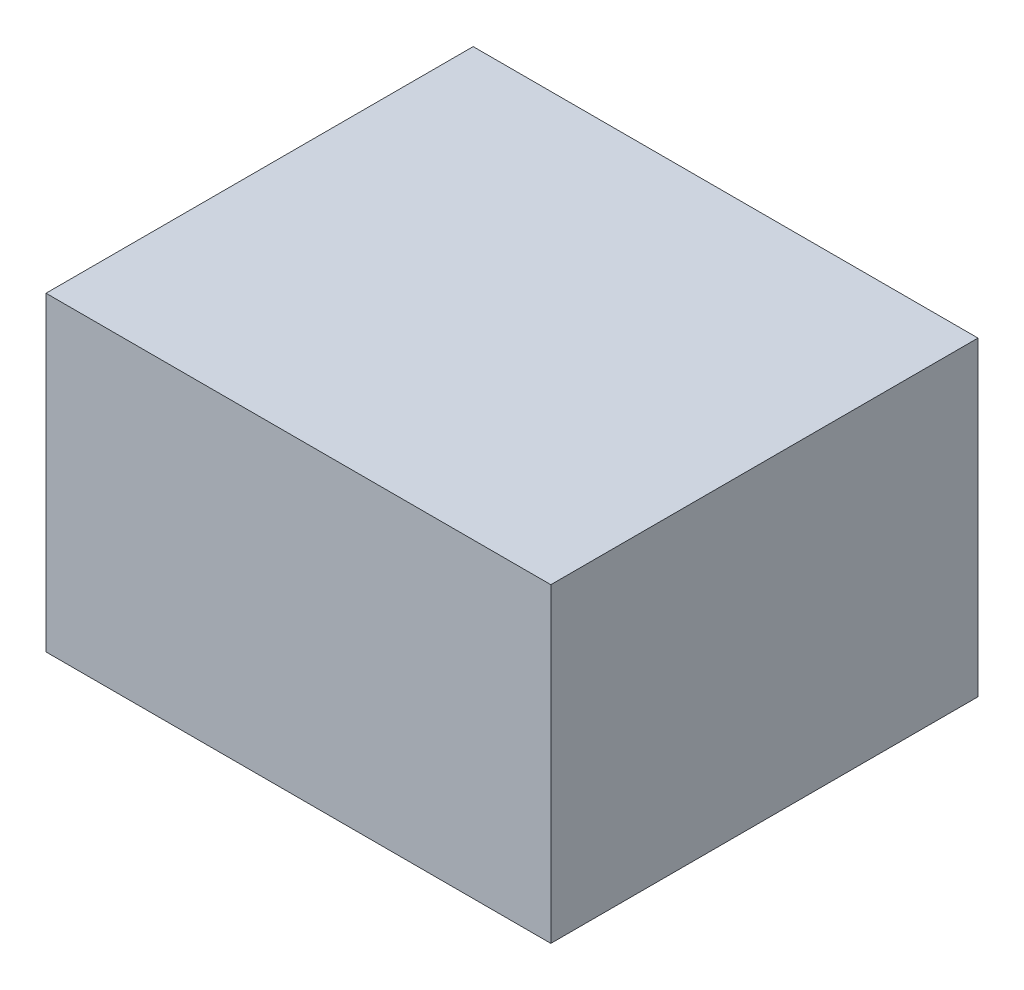
ISO-10303-21;
HEADER;
FILE_DESCRIPTION(('STEP AP214'),'2;1');
FILE_NAME('part.step','',(''),(''),'','','');
FILE_SCHEMA(('AUTOMOTIVE_DESIGN { 1 0 10303 214 1 1 1 1 }'));
ENDSEC;
DATA;
#1=APPLICATION_CONTEXT('core data for automotive mechanical design processes');
#2=APPLICATION_PROTOCOL_DEFINITION('international standard','automotive_design',2000,#1);
#3=PRODUCT_CONTEXT('',#1,'mechanical');
#4=PRODUCT('Part','Part','',(#3));
#5=PRODUCT_RELATED_PRODUCT_CATEGORY('part','',(#4));
#6=PRODUCT_DEFINITION_FORMATION('','',#4);
#7=PRODUCT_DEFINITION_CONTEXT('part definition',#1,'design');
#8=PRODUCT_DEFINITION('design','',#6,#7);
#9=PRODUCT_DEFINITION_SHAPE('','',#8);
#10=(LENGTH_UNIT() NAMED_UNIT(*) SI_UNIT(.MILLI.,.METRE.));
#11=(NAMED_UNIT(*) PLANE_ANGLE_UNIT() SI_UNIT($,.RADIAN.));
#12=(NAMED_UNIT(*) SI_UNIT($,.STERADIAN.) SOLID_ANGLE_UNIT());
#13=UNCERTAINTY_MEASURE_WITH_UNIT(LENGTH_MEASURE(1.E-05),#10,'distance_accuracy_value','');
#14=(GEOMETRIC_REPRESENTATION_CONTEXT(3) GLOBAL_UNCERTAINTY_ASSIGNED_CONTEXT((#13)) GLOBAL_UNIT_ASSIGNED_CONTEXT((#10,
#11,#12)) REPRESENTATION_CONTEXT('',''));
#15=CARTESIAN_POINT('',(0.,0.,0.));
#16=DIRECTION('',(0.,0.,1.));
#17=DIRECTION('',(1.,0.,0.));
#18=AXIS2_PLACEMENT_3D('',#15,#16,#17);
#19=CARTESIAN_POINT('',(32.5,40.,27.5));
#20=DIRECTION('',(-1.,0.,0.));
#21=DIRECTION('',(0.,0.,1.));
#22=AXIS2_PLACEMENT_3D('',#19,#20,#21);
#23=PLANE('',#22);
#24=DIRECTION('',(0.,0.,-1.));
#25=VECTOR('',#24,1.);
#26=CARTESIAN_POINT('',(32.5,0.,27.5));
#27=LINE('',#26,#25);
#28=CARTESIAN_POINT('',(32.5,0.,27.5));
#29=VERTEX_POINT('',#28);
#30=CARTESIAN_POINT('',(32.5,0.,-27.5));
#31=VERTEX_POINT('',#30);
#32=EDGE_CURVE('E98',#29,#31,#27,.T.);
#33=ORIENTED_EDGE('',*,*,#32,.T.);
#34=DIRECTION('',(0.,-1.,0.));
#35=VECTOR('',#34,1.);
#36=CARTESIAN_POINT('',(32.5,40.,-27.5));
#37=LINE('',#36,#35);
#38=CARTESIAN_POINT('',(32.5,40.,-27.5));
#39=VERTEX_POINT('',#38);
#40=EDGE_CURVE('E11',#39,#31,#37,.T.);
#41=ORIENTED_EDGE('',*,*,#40,.F.);
#42=DIRECTION('',(0.,0.,-1.));
#43=VECTOR('',#42,1.);
#44=CARTESIAN_POINT('',(32.5,40.,27.5));
#45=LINE('',#44,#43);
#46=CARTESIAN_POINT('',(32.5,40.,27.5));
#47=VERTEX_POINT('',#46);
#48=EDGE_CURVE('E86',#47,#39,#45,.T.);
#49=ORIENTED_EDGE('',*,*,#48,.F.);
#50=DIRECTION('',(0.,-1.,0.));
#51=VECTOR('',#50,1.);
#52=CARTESIAN_POINT('',(32.5,40.,27.5));
#53=LINE('',#52,#51);
#54=EDGE_CURVE('E94',#47,#29,#53,.T.);
#55=ORIENTED_EDGE('',*,*,#54,.T.);
#56=EDGE_LOOP('',(#33,#41,#49,#55));
#57=FACE_BOUND('',#56,.T.);
#58=ADVANCED_FACE('F35',(#57),#23,.F.);
#59=CARTESIAN_POINT('',(-32.5,40.,-27.5));
#60=DIRECTION('',(0.,0.,1.));
#61=DIRECTION('',(1.,0.,0.));
#62=AXIS2_PLACEMENT_3D('',#59,#60,#61);
#63=PLANE('',#62);
#64=DIRECTION('',(-1.,0.,0.));
#65=VECTOR('',#64,1.);
#66=CARTESIAN_POINT('',(-32.5,0.,-27.5));
#67=LINE('',#66,#65);
#68=CARTESIAN_POINT('',(-32.5,0.,-27.5));
#69=VERTEX_POINT('',#68);
#70=EDGE_CURVE('E90',#31,#69,#67,.T.);
#71=ORIENTED_EDGE('',*,*,#70,.T.);
#72=DIRECTION('',(0.,-1.,0.));
#73=VECTOR('',#72,1.);
#74=CARTESIAN_POINT('',(-32.5,40.,-27.5));
#75=LINE('',#74,#73);
#76=CARTESIAN_POINT('',(-32.5,40.,-27.5));
#77=VERTEX_POINT('',#76);
#78=EDGE_CURVE('E43',#77,#69,#75,.T.);
#79=ORIENTED_EDGE('',*,*,#78,.F.);
#80=DIRECTION('',(-1.,0.,0.));
#81=VECTOR('',#80,1.);
#82=CARTESIAN_POINT('',(-32.5,40.,-27.5));
#83=LINE('',#82,#81);
#84=EDGE_CURVE('E81',#39,#77,#83,.T.);
#85=ORIENTED_EDGE('',*,*,#84,.F.);
#86=ORIENTED_EDGE('',*,*,#40,.T.);
#87=EDGE_LOOP('',(#71,#79,#85,#86));
#88=FACE_BOUND('',#87,.T.);
#89=ADVANCED_FACE('F89',(#88),#63,.F.);
#90=CARTESIAN_POINT('',(-32.5,40.,27.5));
#91=DIRECTION('',(1.,0.,0.));
#92=DIRECTION('',(0.,0.,-1.));
#93=AXIS2_PLACEMENT_3D('',#90,#91,#92);
#94=PLANE('',#93);
#95=DIRECTION('',(0.,0.,1.));
#96=VECTOR('',#95,1.);
#97=CARTESIAN_POINT('',(-32.5,0.,27.5));
#98=LINE('',#97,#96);
#99=CARTESIAN_POINT('',(-32.5,0.,27.5));
#100=VERTEX_POINT('',#99);
#101=EDGE_CURVE('E68',#69,#100,#98,.T.);
#102=ORIENTED_EDGE('',*,*,#101,.T.);
#103=DIRECTION('',(0.,-1.,0.));
#104=VECTOR('',#103,1.);
#105=CARTESIAN_POINT('',(-32.5,40.,27.5));
#106=LINE('',#105,#104);
#107=CARTESIAN_POINT('',(-32.5,40.,27.5));
#108=VERTEX_POINT('',#107);
#109=EDGE_CURVE('E91',#108,#100,#106,.T.);
#110=ORIENTED_EDGE('',*,*,#109,.F.);
#111=DIRECTION('',(0.,0.,1.));
#112=VECTOR('',#111,1.);
#113=CARTESIAN_POINT('',(-32.5,40.,27.5));
#114=LINE('',#113,#112);
#115=EDGE_CURVE('E84',#77,#108,#114,.T.);
#116=ORIENTED_EDGE('',*,*,#115,.F.);
#117=ORIENTED_EDGE('',*,*,#78,.T.);
#118=EDGE_LOOP('',(#102,#110,#116,#117));
#119=FACE_BOUND('',#118,.T.);
#120=ADVANCED_FACE('F92',(#119),#94,.F.);
#121=CARTESIAN_POINT('',(-32.5,40.,27.5));
#122=DIRECTION('',(0.,0.,-1.));
#123=DIRECTION('',(-1.,0.,0.));
#124=AXIS2_PLACEMENT_3D('',#121,#122,#123);
#125=PLANE('',#124);
#126=DIRECTION('',(1.,0.,0.));
#127=VECTOR('',#126,1.);
#128=CARTESIAN_POINT('',(-32.5,0.,27.5));
#129=LINE('',#128,#127);
#130=EDGE_CURVE('E74',#100,#29,#129,.T.);
#131=ORIENTED_EDGE('',*,*,#130,.T.);
#132=ORIENTED_EDGE('',*,*,#54,.F.);
#133=DIRECTION('',(1.,0.,0.));
#134=VECTOR('',#133,1.);
#135=CARTESIAN_POINT('',(-32.5,40.,27.5));
#136=LINE('',#135,#134);
#137=EDGE_CURVE('E51',#108,#47,#136,.T.);
#138=ORIENTED_EDGE('',*,*,#137,.F.);
#139=ORIENTED_EDGE('',*,*,#109,.T.);
#140=EDGE_LOOP('',(#131,#132,#138,#139));
#141=FACE_BOUND('',#140,.T.);
#142=ADVANCED_FACE('F105',(#141),#125,.F.);
#143=CARTESIAN_POINT('',(0.,40.,0.));
#144=DIRECTION('',(0.,-1.,0.));
#145=DIRECTION('',(0.,0.,-1.));
#146=AXIS2_PLACEMENT_3D('',#143,#144,#145);
#147=PLANE('',#146);
#148=ORIENTED_EDGE('',*,*,#48,.T.);
#149=ORIENTED_EDGE('',*,*,#84,.T.);
#150=ORIENTED_EDGE('',*,*,#115,.T.);
#151=ORIENTED_EDGE('',*,*,#137,.T.);
#152=EDGE_LOOP('',(#148,#149,#150,#151));
#153=FACE_BOUND('',#152,.T.);
#154=ADVANCED_FACE('F82',(#153),#147,.F.);
#155=CARTESIAN_POINT('',(0.,0.,0.));
#156=DIRECTION('',(0.,-1.,0.));
#157=DIRECTION('',(0.,0.,-1.));
#158=AXIS2_PLACEMENT_3D('',#155,#156,#157);
#159=PLANE('',#158);
#160=ORIENTED_EDGE('',*,*,#32,.F.);
#161=ORIENTED_EDGE('',*,*,#130,.F.);
#162=ORIENTED_EDGE('',*,*,#101,.F.);
#163=ORIENTED_EDGE('',*,*,#70,.F.);
#164=EDGE_LOOP('',(#160,#161,#162,#163));
#165=FACE_BOUND('',#164,.T.);
#166=ADVANCED_FACE('F108',(#165),#159,.T.);
#167=CLOSED_SHELL('',(#58,#89,#120,#142,#154,#166));
#168=MANIFOLD_SOLID_BREP('B2',#167);
#169=ADVANCED_BREP_SHAPE_REPRESENTATION('',(#18,#168),#14);
#170=SHAPE_DEFINITION_REPRESENTATION(#9,#169);
ENDSEC;
END-ISO-10303-21;
